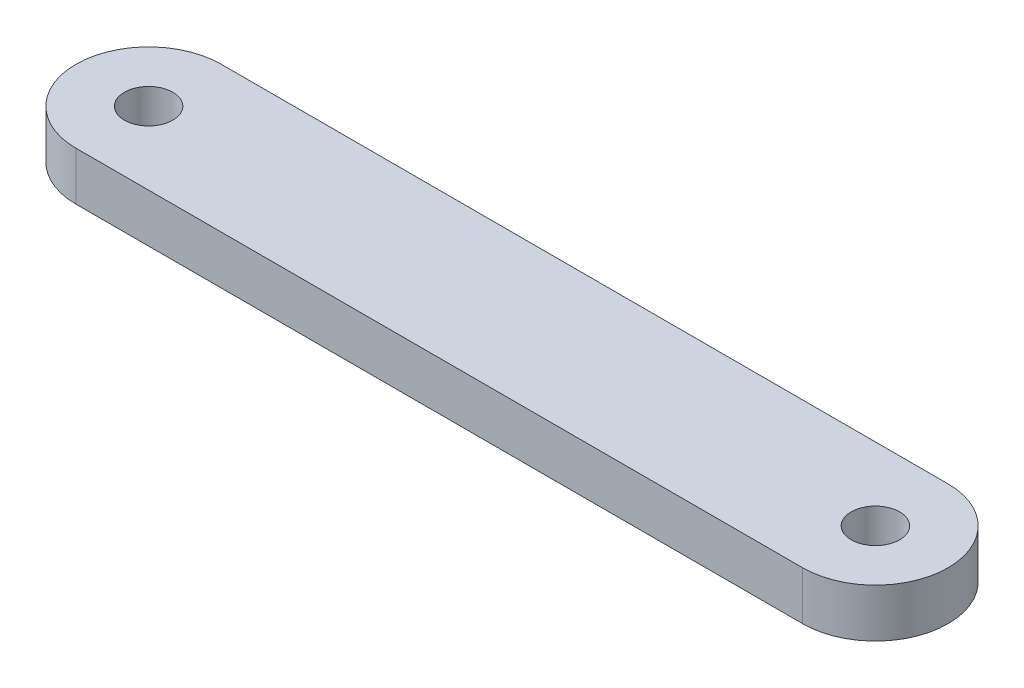
ISO-10303-21;
HEADER;
FILE_DESCRIPTION(('STEP AP214'),'2;1');
FILE_NAME('part.step','',(''),(''),'','','');
FILE_SCHEMA(('AUTOMOTIVE_DESIGN { 1 0 10303 214 1 1 1 1 }'));
ENDSEC;
DATA;
#1=APPLICATION_CONTEXT('core data for automotive mechanical design processes');
#2=APPLICATION_PROTOCOL_DEFINITION('international standard','automotive_design',2000,#1);
#3=PRODUCT_CONTEXT('',#1,'mechanical');
#4=PRODUCT('Part','Part','',(#3));
#5=PRODUCT_RELATED_PRODUCT_CATEGORY('part','',(#4));
#6=PRODUCT_DEFINITION_FORMATION('','',#4);
#7=PRODUCT_DEFINITION_CONTEXT('part definition',#1,'design');
#8=PRODUCT_DEFINITION('design','',#6,#7);
#9=PRODUCT_DEFINITION_SHAPE('','',#8);
#10=(LENGTH_UNIT() NAMED_UNIT(*) SI_UNIT(.MILLI.,.METRE.));
#11=(NAMED_UNIT(*) PLANE_ANGLE_UNIT() SI_UNIT($,.RADIAN.));
#12=(NAMED_UNIT(*) SI_UNIT($,.STERADIAN.) SOLID_ANGLE_UNIT());
#13=UNCERTAINTY_MEASURE_WITH_UNIT(LENGTH_MEASURE(1.E-05),#10,'distance_accuracy_value','');
#14=(GEOMETRIC_REPRESENTATION_CONTEXT(3) GLOBAL_UNCERTAINTY_ASSIGNED_CONTEXT((#13)) GLOBAL_UNIT_ASSIGNED_CONTEXT((#10,
#11,#12)) REPRESENTATION_CONTEXT('',''));
#15=CARTESIAN_POINT('',(0.,0.,0.));
#16=DIRECTION('',(0.,0.,1.));
#17=DIRECTION('',(1.,0.,0.));
#18=AXIS2_PLACEMENT_3D('',#15,#16,#17);
#19=CARTESIAN_POINT('',(37.5,5.,0.));
#20=DIRECTION('',(0.,-1.,0.));
#21=DIRECTION('',(0.,0.,-1.));
#22=AXIS2_PLACEMENT_3D('',#19,#20,#21);
#23=PLANE('',#22);
#24=CARTESIAN_POINT('',(37.5,5.,0.));
#25=DIRECTION('',(0.,1.,0.));
#26=DIRECTION('',(0.,0.,-1.));
#27=AXIS2_PLACEMENT_3D('',#24,#25,#26);
#28=CIRCLE('',#27,7.5);
#29=CARTESIAN_POINT('',(37.5,5.,7.5));
#30=VERTEX_POINT('',#29);
#31=CARTESIAN_POINT('',(37.5,5.,-7.5));
#32=VERTEX_POINT('',#31);
#33=EDGE_CURVE('E92',#30,#32,#28,.T.);
#34=ORIENTED_EDGE('',*,*,#33,.T.);
#35=DIRECTION('',(-1.,0.,0.));
#36=VECTOR('',#35,1.);
#37=CARTESIAN_POINT('',(-37.5,5.,-7.5));
#38=LINE('',#37,#36);
#39=CARTESIAN_POINT('',(-37.5,5.,-7.5));
#40=VERTEX_POINT('',#39);
#41=EDGE_CURVE('E87',#32,#40,#38,.T.);
#42=ORIENTED_EDGE('',*,*,#41,.T.);
#43=CARTESIAN_POINT('',(-37.5,5.,0.));
#44=DIRECTION('',(0.,1.,0.));
#45=DIRECTION('',(0.,0.,1.));
#46=AXIS2_PLACEMENT_3D('',#43,#44,#45);
#47=CIRCLE('',#46,7.5);
#48=CARTESIAN_POINT('',(-37.5,5.,7.5));
#49=VERTEX_POINT('',#48);
#50=EDGE_CURVE('E90',#40,#49,#47,.T.);
#51=ORIENTED_EDGE('',*,*,#50,.T.);
#52=DIRECTION('',(1.,0.,0.));
#53=VECTOR('',#52,1.);
#54=CARTESIAN_POINT('',(-37.5,5.,7.5));
#55=LINE('',#54,#53);
#56=EDGE_CURVE('E57',#49,#30,#55,.T.);
#57=ORIENTED_EDGE('',*,*,#56,.T.);
#58=EDGE_LOOP('',(#34,#42,#51,#57));
#59=FACE_BOUND('',#58,.T.);
#60=CARTESIAN_POINT('',(37.5,5.,0.));
#61=DIRECTION('',(0.,1.,0.));
#62=DIRECTION('',(0.,0.,1.));
#63=AXIS2_PLACEMENT_3D('',#60,#61,#62);
#64=CIRCLE('',#63,2.5);
#65=CARTESIAN_POINT('',(37.5,5.,2.5));
#66=VERTEX_POINT('',#65);
#67=EDGE_CURVE('E112',#66,#66,#64,.T.);
#68=ORIENTED_EDGE('',*,*,#67,.F.);
#69=EDGE_LOOP('',(#68));
#70=FACE_BOUND('',#69,.T.);
#71=CARTESIAN_POINT('',(-37.5,5.,0.));
#72=DIRECTION('',(0.,1.,0.));
#73=DIRECTION('',(0.,0.,1.));
#74=AXIS2_PLACEMENT_3D('',#71,#72,#73);
#75=CIRCLE('',#74,2.5);
#76=CARTESIAN_POINT('',(-37.5,5.,2.5));
#77=VERTEX_POINT('',#76);
#78=EDGE_CURVE('E134',#77,#77,#75,.T.);
#79=ORIENTED_EDGE('',*,*,#78,.F.);
#80=EDGE_LOOP('',(#79));
#81=FACE_BOUND('',#80,.T.);
#82=ADVANCED_FACE('F39',(#59,#70,#81),#23,.F.);
#83=CARTESIAN_POINT('',(37.5,0.,0.));
#84=DIRECTION('',(0.,-1.,0.));
#85=DIRECTION('',(0.,0.,-1.));
#86=AXIS2_PLACEMENT_3D('',#83,#84,#85);
#87=PLANE('',#86);
#88=CARTESIAN_POINT('',(37.5,0.,0.));
#89=DIRECTION('',(0.,1.,0.));
#90=DIRECTION('',(0.,0.,1.));
#91=AXIS2_PLACEMENT_3D('',#88,#89,#90);
#92=CIRCLE('',#91,2.5);
#93=CARTESIAN_POINT('',(37.5,0.,2.5));
#94=VERTEX_POINT('',#93);
#95=EDGE_CURVE('E130',#94,#94,#92,.T.);
#96=ORIENTED_EDGE('',*,*,#95,.T.);
#97=EDGE_LOOP('',(#96));
#98=FACE_BOUND('',#97,.T.);
#99=CARTESIAN_POINT('',(37.5,0.,0.));
#100=DIRECTION('',(0.,1.,0.));
#101=DIRECTION('',(0.,0.,-1.));
#102=AXIS2_PLACEMENT_3D('',#99,#100,#101);
#103=CIRCLE('',#102,7.5);
#104=CARTESIAN_POINT('',(37.5,0.,7.5));
#105=VERTEX_POINT('',#104);
#106=CARTESIAN_POINT('',(37.5,0.,-7.5));
#107=VERTEX_POINT('',#106);
#108=EDGE_CURVE('E108',#105,#107,#103,.T.);
#109=ORIENTED_EDGE('',*,*,#108,.F.);
#110=DIRECTION('',(1.,0.,0.));
#111=VECTOR('',#110,1.);
#112=CARTESIAN_POINT('',(-37.5,0.,7.5));
#113=LINE('',#112,#111);
#114=CARTESIAN_POINT('',(-37.5,0.,7.5));
#115=VERTEX_POINT('',#114);
#116=EDGE_CURVE('E80',#115,#105,#113,.T.);
#117=ORIENTED_EDGE('',*,*,#116,.F.);
#118=CARTESIAN_POINT('',(-37.5,0.,0.));
#119=DIRECTION('',(0.,1.,0.));
#120=DIRECTION('',(0.,0.,1.));
#121=AXIS2_PLACEMENT_3D('',#118,#119,#120);
#122=CIRCLE('',#121,7.5);
#123=CARTESIAN_POINT('',(-37.5,0.,-7.5));
#124=VERTEX_POINT('',#123);
#125=EDGE_CURVE('E74',#124,#115,#122,.T.);
#126=ORIENTED_EDGE('',*,*,#125,.F.);
#127=DIRECTION('',(-1.,0.,0.));
#128=VECTOR('',#127,1.);
#129=CARTESIAN_POINT('',(-37.5,0.,-7.5));
#130=LINE('',#129,#128);
#131=EDGE_CURVE('E97',#107,#124,#130,.T.);
#132=ORIENTED_EDGE('',*,*,#131,.F.);
#133=EDGE_LOOP('',(#109,#117,#126,#132));
#134=FACE_BOUND('',#133,.T.);
#135=CARTESIAN_POINT('',(-37.5,0.,0.));
#136=DIRECTION('',(0.,1.,0.));
#137=DIRECTION('',(0.,0.,1.));
#138=AXIS2_PLACEMENT_3D('',#135,#136,#137);
#139=CIRCLE('',#138,2.5);
#140=CARTESIAN_POINT('',(-37.5,0.,2.5));
#141=VERTEX_POINT('',#140);
#142=EDGE_CURVE('E138',#141,#141,#139,.T.);
#143=ORIENTED_EDGE('',*,*,#142,.T.);
#144=EDGE_LOOP('',(#143));
#145=FACE_BOUND('',#144,.T.);
#146=ADVANCED_FACE('F125',(#98,#134,#145),#87,.T.);
#147=CARTESIAN_POINT('',(37.5,5.,0.));
#148=DIRECTION('',(0.,-1.,0.));
#149=DIRECTION('',(0.,0.,-1.));
#150=AXIS2_PLACEMENT_3D('',#147,#148,#149);
#151=CYLINDRICAL_SURFACE('',#150,7.5);
#152=ORIENTED_EDGE('',*,*,#108,.T.);
#153=DIRECTION('',(0.,-1.,0.));
#154=VECTOR('',#153,1.);
#155=CARTESIAN_POINT('',(37.5,5.,-7.5));
#156=LINE('',#155,#154);
#157=EDGE_CURVE('E11',#32,#107,#156,.T.);
#158=ORIENTED_EDGE('',*,*,#157,.F.);
#159=ORIENTED_EDGE('',*,*,#33,.F.);
#160=DIRECTION('',(0.,-1.,0.));
#161=VECTOR('',#160,1.);
#162=CARTESIAN_POINT('',(37.5,5.,7.5));
#163=LINE('',#162,#161);
#164=EDGE_CURVE('E104',#30,#105,#163,.T.);
#165=ORIENTED_EDGE('',*,*,#164,.T.);
#166=EDGE_LOOP('',(#152,#158,#159,#165));
#167=FACE_BOUND('',#166,.T.);
#168=ADVANCED_FACE('F41',(#167),#151,.T.);
#169=CARTESIAN_POINT('',(-37.5,5.,-7.5));
#170=DIRECTION('',(0.,0.,1.));
#171=DIRECTION('',(1.,0.,0.));
#172=AXIS2_PLACEMENT_3D('',#169,#170,#171);
#173=PLANE('',#172);
#174=ORIENTED_EDGE('',*,*,#131,.T.);
#175=DIRECTION('',(0.,-1.,0.));
#176=VECTOR('',#175,1.);
#177=CARTESIAN_POINT('',(-37.5,5.,-7.5));
#178=LINE('',#177,#176);
#179=EDGE_CURVE('E49',#40,#124,#178,.T.);
#180=ORIENTED_EDGE('',*,*,#179,.F.);
#181=ORIENTED_EDGE('',*,*,#41,.F.);
#182=ORIENTED_EDGE('',*,*,#157,.T.);
#183=EDGE_LOOP('',(#174,#180,#181,#182));
#184=FACE_BOUND('',#183,.T.);
#185=ADVANCED_FACE('F96',(#184),#173,.F.);
#186=CARTESIAN_POINT('',(-37.5,5.,0.));
#187=DIRECTION('',(0.,-1.,0.));
#188=DIRECTION('',(0.,0.,-1.));
#189=AXIS2_PLACEMENT_3D('',#186,#187,#188);
#190=CYLINDRICAL_SURFACE('',#189,7.5);
#191=ORIENTED_EDGE('',*,*,#125,.T.);
#192=DIRECTION('',(0.,-1.,0.));
#193=VECTOR('',#192,1.);
#194=CARTESIAN_POINT('',(-37.5,5.,7.5));
#195=LINE('',#194,#193);
#196=EDGE_CURVE('E99',#49,#115,#195,.T.);
#197=ORIENTED_EDGE('',*,*,#196,.F.);
#198=ORIENTED_EDGE('',*,*,#50,.F.);
#199=ORIENTED_EDGE('',*,*,#179,.T.);
#200=EDGE_LOOP('',(#191,#197,#198,#199));
#201=FACE_BOUND('',#200,.T.);
#202=ADVANCED_FACE('F100',(#201),#190,.T.);
#203=CARTESIAN_POINT('',(-37.5,5.,7.5));
#204=DIRECTION('',(0.,0.,-1.));
#205=DIRECTION('',(-1.,0.,0.));
#206=AXIS2_PLACEMENT_3D('',#203,#204,#205);
#207=PLANE('',#206);
#208=ORIENTED_EDGE('',*,*,#116,.T.);
#209=ORIENTED_EDGE('',*,*,#164,.F.);
#210=ORIENTED_EDGE('',*,*,#56,.F.);
#211=ORIENTED_EDGE('',*,*,#196,.T.);
#212=EDGE_LOOP('',(#208,#209,#210,#211));
#213=FACE_BOUND('',#212,.T.);
#214=ADVANCED_FACE('F122',(#213),#207,.F.);
#215=CARTESIAN_POINT('',(37.5,5.,0.));
#216=DIRECTION('',(0.,-1.,0.));
#217=DIRECTION('',(0.,0.,-1.));
#218=AXIS2_PLACEMENT_3D('',#215,#216,#217);
#219=CYLINDRICAL_SURFACE('',#218,2.5);
#220=ORIENTED_EDGE('',*,*,#67,.T.);
#221=EDGE_LOOP('',(#220));
#222=FACE_BOUND('',#221,.T.);
#223=ORIENTED_EDGE('',*,*,#95,.F.);
#224=EDGE_LOOP('',(#223));
#225=FACE_BOUND('',#224,.T.);
#226=ADVANCED_FACE('F157',(#222,#225),#219,.F.);
#227=CARTESIAN_POINT('',(-37.5,5.,0.));
#228=DIRECTION('',(0.,-1.,0.));
#229=DIRECTION('',(0.,0.,-1.));
#230=AXIS2_PLACEMENT_3D('',#227,#228,#229);
#231=CYLINDRICAL_SURFACE('',#230,2.5);
#232=ORIENTED_EDGE('',*,*,#78,.T.);
#233=EDGE_LOOP('',(#232));
#234=FACE_BOUND('',#233,.T.);
#235=ORIENTED_EDGE('',*,*,#142,.F.);
#236=EDGE_LOOP('',(#235));
#237=FACE_BOUND('',#236,.T.);
#238=ADVANCED_FACE('F146',(#234,#237),#231,.F.);
#239=CLOSED_SHELL('',(#82,#146,#168,#185,#202,#214,#226,#238));
#240=MANIFOLD_SOLID_BREP('B2',#239);
#241=ADVANCED_BREP_SHAPE_REPRESENTATION('',(#18,#240),#14);
#242=SHAPE_DEFINITION_REPRESENTATION(#9,#241);
ENDSEC;
END-ISO-10303-21;
